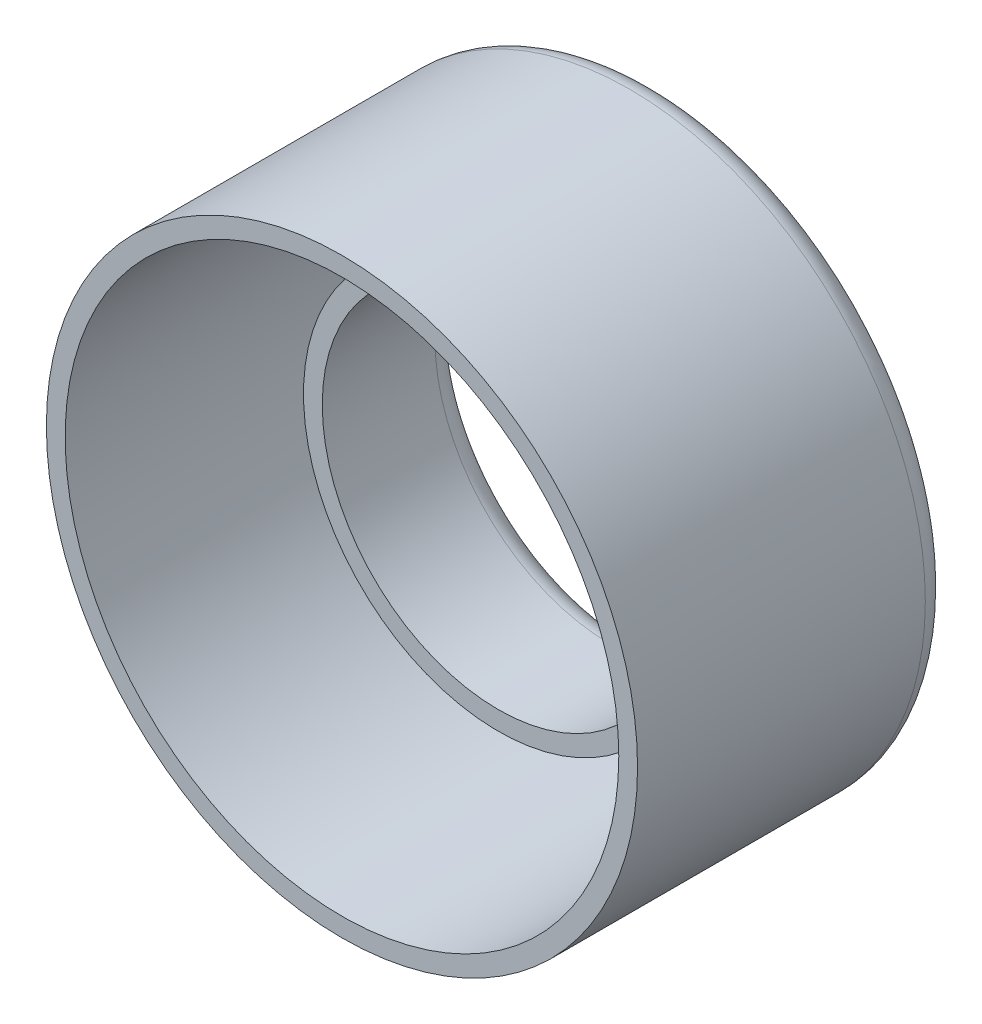
ISO-10303-21;
HEADER;
FILE_DESCRIPTION(('STEP AP214'),'2;1');
FILE_NAME('part.step','',(''),(''),'','','');
FILE_SCHEMA(('AUTOMOTIVE_DESIGN { 1 0 10303 214 1 1 1 1 }'));
ENDSEC;
DATA;
#1=APPLICATION_CONTEXT('core data for automotive mechanical design processes');
#2=APPLICATION_PROTOCOL_DEFINITION('international standard','automotive_design',2000,#1);
#3=PRODUCT_CONTEXT('',#1,'mechanical');
#4=PRODUCT('Part','Part','',(#3));
#5=PRODUCT_RELATED_PRODUCT_CATEGORY('part','',(#4));
#6=PRODUCT_DEFINITION_FORMATION('','',#4);
#7=PRODUCT_DEFINITION_CONTEXT('part definition',#1,'design');
#8=PRODUCT_DEFINITION('design','',#6,#7);
#9=PRODUCT_DEFINITION_SHAPE('','',#8);
#10=(LENGTH_UNIT() NAMED_UNIT(*) SI_UNIT(.MILLI.,.METRE.));
#11=(NAMED_UNIT(*) PLANE_ANGLE_UNIT() SI_UNIT($,.RADIAN.));
#12=(NAMED_UNIT(*) SI_UNIT($,.STERADIAN.) SOLID_ANGLE_UNIT());
#13=UNCERTAINTY_MEASURE_WITH_UNIT(LENGTH_MEASURE(1.E-05),#10,'distance_accuracy_value','');
#14=(GEOMETRIC_REPRESENTATION_CONTEXT(3) GLOBAL_UNCERTAINTY_ASSIGNED_CONTEXT((#13)) GLOBAL_UNIT_ASSIGNED_CONTEXT((#10,
#11,#12)) REPRESENTATION_CONTEXT('',''));
#15=CARTESIAN_POINT('',(0.,0.,0.));
#16=DIRECTION('',(0.,0.,1.));
#17=DIRECTION('',(1.,0.,0.));
#18=AXIS2_PLACEMENT_3D('',#15,#16,#17);
#19=CARTESIAN_POINT('',(-6.243759743434,131.24104,102.1676));
#20=DIRECTION('',(0.,0.,1.));
#21=DIRECTION('',(0.,-1.,0.));
#22=AXIS2_PLACEMENT_3D('',#19,#20,#21);
#23=PLANE('',#22);
#24=CARTESIAN_POINT('',(0.,125.,102.167600000046));
#25=DIRECTION('',(0.,0.,1.));
#26=DIRECTION('',(1.,0.,0.));
#27=AXIS2_PLACEMENT_3D('',#24,#25,#26);
#28=CIRCLE('',#27,5.62);
#29=CARTESIAN_POINT('',(5.62,125.,102.167600000046));
#30=VERTEX_POINT('',#29);
#31=EDGE_CURVE('E18',#30,#30,#28,.T.);
#32=ORIENTED_EDGE('',*,*,#31,.F.);
#33=EDGE_LOOP('',(#32));
#34=FACE_BOUND('',#33,.T.);
#35=CARTESIAN_POINT('',(0.,125.,102.1676));
#36=DIRECTION('',(0.,0.,1.));
#37=DIRECTION('',(1.,0.,0.));
#38=AXIS2_PLACEMENT_3D('',#35,#36,#37);
#39=CIRCLE('',#38,6.00100000000001);
#40=CARTESIAN_POINT('',(6.00100000000001,125.,102.1676));
#41=VERTEX_POINT('',#40);
#42=EDGE_CURVE('E32',#41,#41,#39,.T.);
#43=ORIENTED_EDGE('',*,*,#42,.T.);
#44=EDGE_LOOP('',(#43));
#45=FACE_BOUND('',#44,.T.);
#46=ADVANCED_FACE('F14',(#34,#45),#23,.T.);
#47=CARTESIAN_POINT('',(0.,125.,96.4911096223538));
#48=DIRECTION('',(0.,0.,1.));
#49=DIRECTION('',(1.,0.,0.));
#50=AXIS2_PLACEMENT_3D('',#47,#48,#49);
#51=CYLINDRICAL_SURFACE('',#50,5.62);
#52=CARTESIAN_POINT('',(0.,125.,96.4911096223501));
#53=DIRECTION('',(0.,0.,1.));
#54=DIRECTION('',(0.,-1.,0.));
#55=AXIS2_PLACEMENT_3D('',#52,#53,#54);
#56=CIRCLE('',#55,5.61999999999999);
#57=CARTESIAN_POINT('',(0.,119.38,96.4911096223501));
#58=VERTEX_POINT('',#57);
#59=EDGE_CURVE('E30',#58,#58,#56,.T.);
#60=ORIENTED_EDGE('',*,*,#59,.F.);
#61=EDGE_LOOP('',(#60));
#62=FACE_BOUND('',#61,.T.);
#63=ORIENTED_EDGE('',*,*,#31,.T.);
#64=EDGE_LOOP('',(#63));
#65=FACE_BOUND('',#64,.T.);
#66=ADVANCED_FACE('F41',(#62,#65),#51,.F.);
#67=CARTESIAN_POINT('',(0.,125.,96.3256));
#68=DIRECTION('',(0.,0.,1.));
#69=DIRECTION('',(1.,0.,0.));
#70=AXIS2_PLACEMENT_3D('',#67,#68,#69);
#71=CYLINDRICAL_SURFACE('',#70,6.00100000000001);
#72=ORIENTED_EDGE('',*,*,#42,.F.);
#73=EDGE_LOOP('',(#72));
#74=FACE_BOUND('',#73,.T.);
#75=CARTESIAN_POINT('',(0.,125.,96.3256000000001));
#76=DIRECTION('',(0.,0.,1.));
#77=DIRECTION('',(0.,-1.,0.));
#78=AXIS2_PLACEMENT_3D('',#75,#76,#77);
#79=CIRCLE('',#78,6.00099999999999);
#80=CARTESIAN_POINT('',(0.,118.999,96.3256000000001));
#81=VERTEX_POINT('',#80);
#82=EDGE_CURVE('E37',#81,#81,#79,.T.);
#83=ORIENTED_EDGE('',*,*,#82,.T.);
#84=EDGE_LOOP('',(#83));
#85=FACE_BOUND('',#84,.T.);
#86=ADVANCED_FACE('F48',(#74,#85),#71,.T.);
#87=CARTESIAN_POINT('',(0.,125.,96.49110962235));
#88=DIRECTION('',(0.,0.,1.));
#89=DIRECTION('',(0.,-1.,0.));
#90=AXIS2_PLACEMENT_3D('',#87,#88,#89);
#91=TOROIDAL_SURFACE('',#90,5.36599999999998,0.254);
#92=CARTESIAN_POINT('',(0.,125.,96.245764462469));
#93=DIRECTION('',(0.,0.,1.));
#94=DIRECTION('',(0.,-1.,0.));
#95=AXIS2_PLACEMENT_3D('',#92,#93,#94);
#96=CIRCLE('',#95,5.30025996250003);
#97=CARTESIAN_POINT('',(0.,119.6997400375,96.245764462469));
#98=VERTEX_POINT('',#97);
#99=EDGE_CURVE('E108',#98,#98,#96,.F.);
#100=ORIENTED_EDGE('',*,*,#99,.T.);
#101=EDGE_LOOP('',(#100));
#102=FACE_BOUND('',#101,.T.);
#103=ORIENTED_EDGE('',*,*,#59,.T.);
#104=EDGE_LOOP('',(#103));
#105=FACE_BOUND('',#104,.T.);
#106=ADVANCED_FACE('F101',(#102,#105),#91,.F.);
#107=CARTESIAN_POINT('',(0.,125.,96.3256));
#108=DIRECTION('',(0.,0.,1.));
#109=DIRECTION('',(0.,-1.,0.));
#110=AXIS2_PLACEMENT_3D('',#107,#108,#109);
#111=TOROIDAL_SURFACE('',#110,5.493,0.508);
#112=ORIENTED_EDGE('',*,*,#82,.F.);
#113=EDGE_LOOP('',(#112));
#114=FACE_BOUND('',#113,.T.);
#115=CARTESIAN_POINT('',(0.,125.,95.8349096802466));
#116=DIRECTION('',(0.,0.,1.));
#117=DIRECTION('',(0.,-1.,0.));
#118=AXIS2_PLACEMENT_3D('',#115,#116,#117);
#119=CIRCLE('',#118,5.36151992509999);
#120=CARTESIAN_POINT('',(0.,119.6384800749,95.8349096802466));
#121=VERTEX_POINT('',#120);
#122=EDGE_CURVE('E91',#121,#121,#119,.F.);
#123=ORIENTED_EDGE('',*,*,#122,.F.);
#124=EDGE_LOOP('',(#123));
#125=FACE_BOUND('',#124,.T.);
#126=ADVANCED_FACE('F96',(#114,#125),#111,.T.);
#127=CARTESIAN_POINT('',(0.,125.,96.245764462469));
#128=DIRECTION('',(0.,0.,-1.));
#129=DIRECTION('',(-1.,0.,0.));
#130=AXIS2_PLACEMENT_3D('',#127,#128,#129);
#131=CONICAL_SURFACE('',#130,5.30025996250003,1.30899693899448);
#132=ORIENTED_EDGE('',*,*,#99,.F.);
#133=EDGE_LOOP('',(#132));
#134=FACE_BOUND('',#133,.T.);
#135=CARTESIAN_POINT('',(0.,125.,96.5555137289226));
#136=DIRECTION('',(0.,0.,1.));
#137=DIRECTION('',(0.,-1.,0.));
#138=AXIS2_PLACEMENT_3D('',#135,#136,#137);
#139=CIRCLE('',#138,4.14425996254389);
#140=CARTESIAN_POINT('',(0.,120.855740037456,96.5555137289226));
#141=VERTEX_POINT('',#140);
#142=EDGE_CURVE('E88',#141,#141,#139,.T.);
#143=ORIENTED_EDGE('',*,*,#142,.F.);
#144=EDGE_LOOP('',(#143));
#145=FACE_BOUND('',#144,.T.);
#146=ADVANCED_FACE('F100',(#134,#145),#131,.T.);
#147=CARTESIAN_POINT('',(0.,125.,95.8349096802466));
#148=DIRECTION('',(0.,0.,-1.));
#149=DIRECTION('',(-1.,0.,0.));
#150=AXIS2_PLACEMENT_3D('',#147,#148,#149);
#151=CONICAL_SURFACE('',#150,5.36151992510006,1.30899693899639);
#152=CARTESIAN_POINT('',(0.,125.,96.2127180415751));
#153=DIRECTION('',(0.,0.,1.));
#154=DIRECTION('',(0.,-1.,0.));
#155=AXIS2_PLACEMENT_3D('',#152,#153,#154);
#156=CIRCLE('',#155,3.95151992508816);
#157=CARTESIAN_POINT('',(0.,121.048480074912,96.2127180415751));
#158=VERTEX_POINT('',#157);
#159=EDGE_CURVE('E83',#158,#158,#156,.T.);
#160=ORIENTED_EDGE('',*,*,#159,.T.);
#161=EDGE_LOOP('',(#160));
#162=FACE_BOUND('',#161,.T.);
#163=ORIENTED_EDGE('',*,*,#122,.T.);
#164=EDGE_LOOP('',(#163));
#165=FACE_BOUND('',#164,.T.);
#166=ADVANCED_FACE('F117',(#162,#165),#151,.F.);
#167=CARTESIAN_POINT('',(0.,125.,96.8008588888));
#168=DIRECTION('',(0.,0.,1.));
#169=DIRECTION('',(0.,-1.,0.));
#170=AXIS2_PLACEMENT_3D('',#167,#168,#169);
#171=TOROIDAL_SURFACE('',#170,4.21000000000002,0.254);
#172=CARTESIAN_POINT('',(0.,125.,96.8008588888039));
#173=DIRECTION('',(0.,0.,1.));
#174=DIRECTION('',(0.,-1.,0.));
#175=AXIS2_PLACEMENT_3D('',#172,#173,#174);
#176=CIRCLE('',#175,3.956);
#177=CARTESIAN_POINT('',(0.,121.044,96.8008588888039));
#178=VERTEX_POINT('',#177);
#179=EDGE_CURVE('E81',#178,#178,#176,.F.);
#180=ORIENTED_EDGE('',*,*,#179,.T.);
#181=EDGE_LOOP('',(#180));
#182=FACE_BOUND('',#181,.T.);
#183=ORIENTED_EDGE('',*,*,#142,.T.);
#184=EDGE_LOOP('',(#183));
#185=FACE_BOUND('',#184,.T.);
#186=ADVANCED_FACE('F69',(#182,#185),#171,.F.);
#187=CARTESIAN_POINT('',(0.,125.,96.70340836133));
#188=DIRECTION('',(0.,0.,1.));
#189=DIRECTION('',(0.,-1.,0.));
#190=AXIS2_PLACEMENT_3D('',#187,#188,#189);
#191=TOROIDAL_SURFACE('',#190,4.083,0.508);
#192=ORIENTED_EDGE('',*,*,#159,.F.);
#193=EDGE_LOOP('',(#192));
#194=FACE_BOUND('',#193,.T.);
#195=CARTESIAN_POINT('',(0.,125.,96.7034083613235));
#196=DIRECTION('',(0.,0.,1.));
#197=DIRECTION('',(0.,-1.,0.));
#198=AXIS2_PLACEMENT_3D('',#195,#196,#197);
#199=CIRCLE('',#198,3.57499999999998);
#200=CARTESIAN_POINT('',(0.,121.425,96.7034083613235));
#201=VERTEX_POINT('',#200);
#202=EDGE_CURVE('E27',#201,#201,#199,.F.);
#203=ORIENTED_EDGE('',*,*,#202,.F.);
#204=EDGE_LOOP('',(#203));
#205=FACE_BOUND('',#204,.T.);
#206=ADVANCED_FACE('F63',(#194,#205),#191,.T.);
#207=CARTESIAN_POINT('',(0.,125.,96.8008588888039));
#208=DIRECTION('',(0.,0.,1.));
#209=DIRECTION('',(1.,0.,0.));
#210=AXIS2_PLACEMENT_3D('',#207,#208,#209);
#211=CYLINDRICAL_SURFACE('',#210,3.95600000000001);
#212=ORIENTED_EDGE('',*,*,#179,.F.);
#213=EDGE_LOOP('',(#212));
#214=FACE_BOUND('',#213,.T.);
#215=CARTESIAN_POINT('',(0.,125.,98.9925999999961));
#216=DIRECTION('',(0.,0.,1.));
#217=DIRECTION('',(1.,0.,0.));
#218=AXIS2_PLACEMENT_3D('',#215,#216,#217);
#219=CIRCLE('',#218,3.95600000000001);
#220=CARTESIAN_POINT('',(3.95600000000001,125.,98.9925999999961));
#221=VERTEX_POINT('',#220);
#222=EDGE_CURVE('E22',#221,#221,#219,.T.);
#223=ORIENTED_EDGE('',*,*,#222,.F.);
#224=EDGE_LOOP('',(#223));
#225=FACE_BOUND('',#224,.T.);
#226=ADVANCED_FACE('F56',(#214,#225),#211,.T.);
#227=CARTESIAN_POINT('',(0.,125.,96.7034083613235));
#228=DIRECTION('',(0.,0.,1.));
#229=DIRECTION('',(1.,0.,0.));
#230=AXIS2_PLACEMENT_3D('',#227,#228,#229);
#231=CYLINDRICAL_SURFACE('',#230,3.57499999999997);
#232=CARTESIAN_POINT('',(0.,125.,98.9925999999965));
#233=DIRECTION('',(0.,0.,1.));
#234=DIRECTION('',(1.,0.,0.));
#235=AXIS2_PLACEMENT_3D('',#232,#233,#234);
#236=CIRCLE('',#235,3.57499999999997);
#237=CARTESIAN_POINT('',(3.57499999999997,125.,98.9925999999965));
#238=VERTEX_POINT('',#237);
#239=EDGE_CURVE('E10',#238,#238,#236,.F.);
#240=ORIENTED_EDGE('',*,*,#239,.F.);
#241=EDGE_LOOP('',(#240));
#242=FACE_BOUND('',#241,.T.);
#243=ORIENTED_EDGE('',*,*,#202,.T.);
#244=EDGE_LOOP('',(#243));
#245=FACE_BOUND('',#244,.T.);
#246=ADVANCED_FACE('F52',(#242,#245),#231,.F.);
#247=CARTESIAN_POINT('',(-4.117073805962,129.11424,98.9926));
#248=DIRECTION('',(0.,0.,1.));
#249=DIRECTION('',(0.,-1.,0.));
#250=AXIS2_PLACEMENT_3D('',#247,#248,#249);
#251=PLANE('',#250);
#252=ORIENTED_EDGE('',*,*,#239,.T.);
#253=EDGE_LOOP('',(#252));
#254=FACE_BOUND('',#253,.T.);
#255=ORIENTED_EDGE('',*,*,#222,.T.);
#256=EDGE_LOOP('',(#255));
#257=FACE_BOUND('',#256,.T.);
#258=ADVANCED_FACE('F16',(#254,#257),#251,.T.);
#259=CLOSED_SHELL('',(#46,#66,#86,#106,#126,#146,#166,#186,#206,#226,#246,#258));
#260=MANIFOLD_SOLID_BREP('B1',#259);
#261=ADVANCED_BREP_SHAPE_REPRESENTATION('',(#18,#260),#14);
#262=SHAPE_DEFINITION_REPRESENTATION(#9,#261);
ENDSEC;
END-ISO-10303-21;
